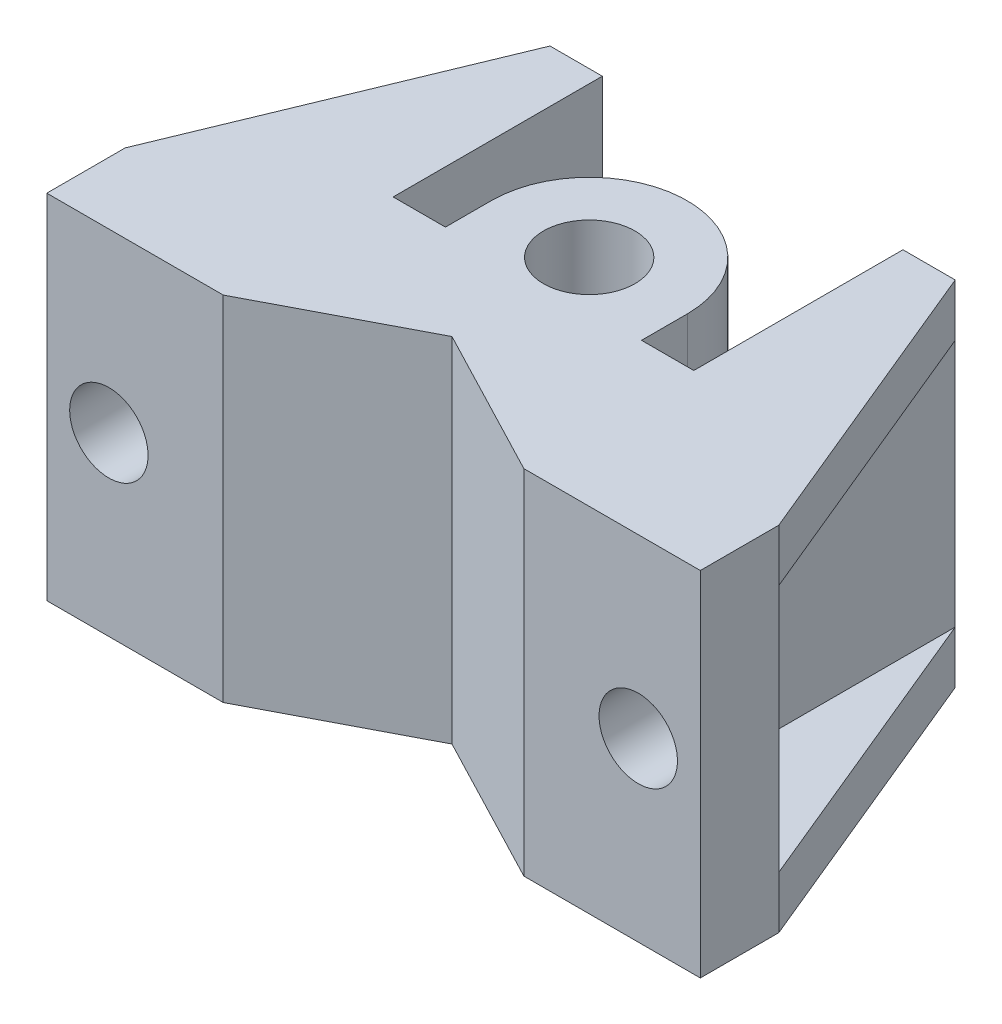
ISO-10303-21;
HEADER;
FILE_DESCRIPTION(('STEP AP214'),'2;1');
FILE_NAME('part.step','',(''),(''),'','','');
FILE_SCHEMA(('AUTOMOTIVE_DESIGN { 1 0 10303 214 1 1 1 1 }'));
ENDSEC;
DATA;
#1=APPLICATION_CONTEXT('core data for automotive mechanical design processes');
#2=APPLICATION_PROTOCOL_DEFINITION('international standard','automotive_design',2000,#1);
#3=PRODUCT_CONTEXT('',#1,'mechanical');
#4=PRODUCT('Part','Part','',(#3));
#5=PRODUCT_RELATED_PRODUCT_CATEGORY('part','',(#4));
#6=PRODUCT_DEFINITION_FORMATION('','',#4);
#7=PRODUCT_DEFINITION_CONTEXT('part definition',#1,'design');
#8=PRODUCT_DEFINITION('design','',#6,#7);
#9=PRODUCT_DEFINITION_SHAPE('','',#8);
#10=(LENGTH_UNIT() NAMED_UNIT(*) SI_UNIT(.MILLI.,.METRE.));
#11=(NAMED_UNIT(*) PLANE_ANGLE_UNIT() SI_UNIT($,.RADIAN.));
#12=(NAMED_UNIT(*) SI_UNIT($,.STERADIAN.) SOLID_ANGLE_UNIT());
#13=UNCERTAINTY_MEASURE_WITH_UNIT(LENGTH_MEASURE(1.E-05),#10,'distance_accuracy_value','');
#14=(GEOMETRIC_REPRESENTATION_CONTEXT(3) GLOBAL_UNCERTAINTY_ASSIGNED_CONTEXT((#13)) GLOBAL_UNIT_ASSIGNED_CONTEXT((#10,
#11,#12)) REPRESENTATION_CONTEXT('',''));
#15=CARTESIAN_POINT('',(0.,0.,0.));
#16=DIRECTION('',(0.,0.,1.));
#17=DIRECTION('',(1.,0.,0.));
#18=AXIS2_PLACEMENT_3D('',#15,#16,#17);
#19=CARTESIAN_POINT('',(-31.,27.,-25.));
#20=DIRECTION('',(0.924261426490025,0.,0.381760154419793));
#21=DIRECTION('',(0.381760154419793,0.,-0.924261426490025));
#22=AXIS2_PLACEMENT_3D('',#19,#20,#21);
#23=PLANE('',#22);
#24=DIRECTION('',(0.,-1.,0.));
#25=VECTOR('',#24,1.);
#26=CARTESIAN_POINT('',(-50.,27.,21.));
#27=LINE('',#26,#25);
#28=CARTESIAN_POINT('',(-50.,-19.,21.));
#29=VERTEX_POINT('',#28);
#30=CARTESIAN_POINT('',(-50.,-27.,21.));
#31=VERTEX_POINT('',#30);
#32=EDGE_CURVE('E235',#29,#31,#27,.T.);
#33=ORIENTED_EDGE('',*,*,#32,.F.);
#34=DIRECTION('',(0.381760154419793,0.,-0.924261426490025));
#35=VECTOR('',#34,1.);
#36=CARTESIAN_POINT('',(-31.,-19.,-25.));
#37=LINE('',#36,#35);
#38=CARTESIAN_POINT('',(-31.,-19.,-25.));
#39=VERTEX_POINT('',#38);
#40=EDGE_CURVE('E11',#29,#39,#37,.T.);
#41=ORIENTED_EDGE('',*,*,#40,.T.);
#42=DIRECTION('',(0.,-1.,0.));
#43=VECTOR('',#42,1.);
#44=CARTESIAN_POINT('',(-31.,27.,-25.));
#45=LINE('',#44,#43);
#46=CARTESIAN_POINT('',(-31.,-27.,-25.));
#47=VERTEX_POINT('',#46);
#48=EDGE_CURVE('E234',#39,#47,#45,.T.);
#49=ORIENTED_EDGE('',*,*,#48,.T.);
#50=DIRECTION('',(-0.381760154419793,0.,0.924261426490025));
#51=VECTOR('',#50,1.);
#52=CARTESIAN_POINT('',(-31.,-27.,-25.));
#53=LINE('',#52,#51);
#54=EDGE_CURVE('E323',#47,#31,#53,.T.);
#55=ORIENTED_EDGE('',*,*,#54,.T.);
#56=EDGE_LOOP('',(#33,#41,#49,#55));
#57=FACE_BOUND('',#56,.T.);
#58=ADVANCED_FACE('F45',(#57),#23,.F.);
#59=CARTESIAN_POINT('',(31.,27.,-25.));
#60=DIRECTION('',(-0.924261426490025,0.,0.381760154419793));
#61=DIRECTION('',(0.381760154419793,0.,0.924261426490025));
#62=AXIS2_PLACEMENT_3D('',#59,#60,#61);
#63=PLANE('',#62);
#64=DIRECTION('',(0.,-1.,0.));
#65=VECTOR('',#64,1.);
#66=CARTESIAN_POINT('',(50.,27.,21.));
#67=LINE('',#66,#65);
#68=CARTESIAN_POINT('',(50.,27.,21.));
#69=VERTEX_POINT('',#68);
#70=CARTESIAN_POINT('',(50.0000000000001,18.9999999999997,21.));
#71=VERTEX_POINT('',#70);
#72=EDGE_CURVE('E260',#69,#71,#67,.T.);
#73=ORIENTED_EDGE('',*,*,#72,.T.);
#74=DIRECTION('',(-0.381760154419793,0.,-0.924261426490025));
#75=VECTOR('',#74,1.);
#76=CARTESIAN_POINT('',(31.,18.9999999999998,-25.));
#77=LINE('',#76,#75);
#78=CARTESIAN_POINT('',(31.0000000000002,18.9999999999998,-25.));
#79=VERTEX_POINT('',#78);
#80=EDGE_CURVE('E229',#71,#79,#77,.T.);
#81=ORIENTED_EDGE('',*,*,#80,.T.);
#82=DIRECTION('',(0.,-1.,0.));
#83=VECTOR('',#82,1.);
#84=CARTESIAN_POINT('',(31.,27.,-25.));
#85=LINE('',#84,#83);
#86=CARTESIAN_POINT('',(31.,27.,-25.));
#87=VERTEX_POINT('',#86);
#88=EDGE_CURVE('E257',#87,#79,#85,.T.);
#89=ORIENTED_EDGE('',*,*,#88,.F.);
#90=DIRECTION('',(-0.381760154419793,0.,-0.924261426490025));
#91=VECTOR('',#90,1.);
#92=CARTESIAN_POINT('',(31.,27.,-25.));
#93=LINE('',#92,#91);
#94=EDGE_CURVE('E530',#69,#87,#93,.T.);
#95=ORIENTED_EDGE('',*,*,#94,.F.);
#96=EDGE_LOOP('',(#73,#81,#89,#95));
#97=FACE_BOUND('',#96,.T.);
#98=ADVANCED_FACE('F255',(#97),#63,.F.);
#99=CARTESIAN_POINT('',(0.,27.,0.));
#100=DIRECTION('',(0.,1.,0.));
#101=DIRECTION('',(0.,0.,1.));
#102=AXIS2_PLACEMENT_3D('',#99,#100,#101);
#103=PLANE('',#102);
#104=DIRECTION('',(-1.,0.,0.));
#105=VECTOR('',#104,1.);
#106=CARTESIAN_POINT('',(-23.,27.,-25.));
#107=LINE('',#106,#105);
#108=CARTESIAN_POINT('',(-23.,27.,-25.));
#109=VERTEX_POINT('',#108);
#110=CARTESIAN_POINT('',(-31.,27.,-25.));
#111=VERTEX_POINT('',#110);
#112=EDGE_CURVE('E364',#109,#111,#107,.T.);
#113=ORIENTED_EDGE('',*,*,#112,.T.);
#114=DIRECTION('',(-0.381760154419793,0.,0.924261426490025));
#115=VECTOR('',#114,1.);
#116=CARTESIAN_POINT('',(-31.,27.,-25.));
#117=LINE('',#116,#115);
#118=CARTESIAN_POINT('',(-50.,27.,21.));
#119=VERTEX_POINT('',#118);
#120=EDGE_CURVE('E467',#111,#119,#117,.T.);
#121=ORIENTED_EDGE('',*,*,#120,.T.);
#122=DIRECTION('',(0.,0.,1.));
#123=VECTOR('',#122,1.);
#124=CARTESIAN_POINT('',(-50.,27.,21.));
#125=LINE('',#124,#123);
#126=CARTESIAN_POINT('',(-50.,27.,33.));
#127=VERTEX_POINT('',#126);
#128=EDGE_CURVE('E232',#119,#127,#125,.T.);
#129=ORIENTED_EDGE('',*,*,#128,.T.);
#130=DIRECTION('',(1.,0.,0.));
#131=VECTOR('',#130,1.);
#132=CARTESIAN_POINT('',(-50.,27.,33.));
#133=LINE('',#132,#131);
#134=CARTESIAN_POINT('',(-23.,27.,33.));
#135=VERTEX_POINT('',#134);
#136=EDGE_CURVE('E307',#127,#135,#133,.T.);
#137=ORIENTED_EDGE('',*,*,#136,.T.);
#138=DIRECTION('',(0.886584846165455,0.,-0.46256600669502));
#139=VECTOR('',#138,1.);
#140=CARTESIAN_POINT('',(-23.,27.,33.));
#141=LINE('',#140,#139);
#142=CARTESIAN_POINT('',(0.,27.,21.));
#143=VERTEX_POINT('',#142);
#144=EDGE_CURVE('E518',#135,#143,#141,.T.);
#145=ORIENTED_EDGE('',*,*,#144,.T.);
#146=DIRECTION('',(0.886584846165455,0.,0.46256600669502));
#147=VECTOR('',#146,1.);
#148=CARTESIAN_POINT('',(23.,27.,33.));
#149=LINE('',#148,#147);
#150=CARTESIAN_POINT('',(23.,27.,33.));
#151=VERTEX_POINT('',#150);
#152=EDGE_CURVE('E521',#143,#151,#149,.T.);
#153=ORIENTED_EDGE('',*,*,#152,.T.);
#154=DIRECTION('',(1.,0.,0.));
#155=VECTOR('',#154,1.);
#156=CARTESIAN_POINT('',(50.,27.,33.));
#157=LINE('',#156,#155);
#158=CARTESIAN_POINT('',(50.,27.,33.));
#159=VERTEX_POINT('',#158);
#160=EDGE_CURVE('E524',#151,#159,#157,.T.);
#161=ORIENTED_EDGE('',*,*,#160,.T.);
#162=DIRECTION('',(0.,0.,-1.));
#163=VECTOR('',#162,1.);
#164=CARTESIAN_POINT('',(50.,27.,21.));
#165=LINE('',#164,#163);
#166=EDGE_CURVE('E527',#159,#69,#165,.T.);
#167=ORIENTED_EDGE('',*,*,#166,.T.);
#168=ORIENTED_EDGE('',*,*,#94,.T.);
#169=DIRECTION('',(-1.,0.,0.));
#170=VECTOR('',#169,1.);
#171=CARTESIAN_POINT('',(23.,27.,-25.));
#172=LINE('',#171,#170);
#173=CARTESIAN_POINT('',(23.,27.,-25.));
#174=VERTEX_POINT('',#173);
#175=EDGE_CURVE('E269',#87,#174,#172,.T.);
#176=ORIENTED_EDGE('',*,*,#175,.T.);
#177=DIRECTION('',(0.,0.,1.));
#178=VECTOR('',#177,1.);
#179=CARTESIAN_POINT('',(23.,27.,7.));
#180=LINE('',#179,#178);
#181=CARTESIAN_POINT('',(23.,27.,7.));
#182=VERTEX_POINT('',#181);
#183=EDGE_CURVE('E402',#174,#182,#180,.T.);
#184=ORIENTED_EDGE('',*,*,#183,.T.);
#185=DIRECTION('',(-1.,0.,0.));
#186=VECTOR('',#185,1.);
#187=CARTESIAN_POINT('',(15.,27.,7.));
#188=LINE('',#187,#186);
#189=CARTESIAN_POINT('',(15.,27.,7.));
#190=VERTEX_POINT('',#189);
#191=EDGE_CURVE('E418',#182,#190,#188,.T.);
#192=ORIENTED_EDGE('',*,*,#191,.T.);
#193=DIRECTION('',(0.,0.,-1.));
#194=VECTOR('',#193,1.);
#195=CARTESIAN_POINT('',(15.,27.,0.));
#196=LINE('',#195,#194);
#197=CARTESIAN_POINT('',(15.,27.,0.));
#198=VERTEX_POINT('',#197);
#199=EDGE_CURVE('E413',#190,#198,#196,.T.);
#200=ORIENTED_EDGE('',*,*,#199,.T.);
#201=CARTESIAN_POINT('',(0.,27.,0.));
#202=DIRECTION('',(0.,1.,0.));
#203=DIRECTION('',(0.,0.,1.));
#204=AXIS2_PLACEMENT_3D('',#201,#202,#203);
#205=CIRCLE('',#204,15.);
#206=CARTESIAN_POINT('',(-15.,27.,1.03825955065933E-13));
#207=VERTEX_POINT('',#206);
#208=EDGE_CURVE('E417',#198,#207,#205,.T.);
#209=ORIENTED_EDGE('',*,*,#208,.T.);
#210=DIRECTION('',(0.,0.,1.));
#211=VECTOR('',#210,1.);
#212=CARTESIAN_POINT('',(-15.,27.,1.02907469966573E-13));
#213=LINE('',#212,#211);
#214=CARTESIAN_POINT('',(-15.,27.,7.));
#215=VERTEX_POINT('',#214);
#216=EDGE_CURVE('E422',#207,#215,#213,.T.);
#217=ORIENTED_EDGE('',*,*,#216,.T.);
#218=DIRECTION('',(-1.,0.,0.));
#219=VECTOR('',#218,1.);
#220=CARTESIAN_POINT('',(-15.,27.,7.));
#221=LINE('',#220,#219);
#222=CARTESIAN_POINT('',(-23.,27.,7.));
#223=VERTEX_POINT('',#222);
#224=EDGE_CURVE('E429',#215,#223,#221,.T.);
#225=ORIENTED_EDGE('',*,*,#224,.T.);
#226=DIRECTION('',(0.,0.,-1.));
#227=VECTOR('',#226,1.);
#228=CARTESIAN_POINT('',(-23.,27.,7.));
#229=LINE('',#228,#227);
#230=EDGE_CURVE('E370',#223,#109,#229,.T.);
#231=ORIENTED_EDGE('',*,*,#230,.T.);
#232=EDGE_LOOP('',(#113,#121,#129,#137,#145,#153,#161,#167,#168,#176,#184,#192,#200,#209,#217,
#225,#231));
#233=FACE_BOUND('',#232,.T.);
#234=CARTESIAN_POINT('',(0.,27.,0.));
#235=DIRECTION('',(0.,1.,0.));
#236=DIRECTION('',(0.,0.,1.));
#237=AXIS2_PLACEMENT_3D('',#234,#235,#236);
#238=CIRCLE('',#237,7.);
#239=CARTESIAN_POINT('',(0.,27.,7.));
#240=VERTEX_POINT('',#239);
#241=EDGE_CURVE('E437',#240,#240,#238,.T.);
#242=ORIENTED_EDGE('',*,*,#241,.F.);
#243=EDGE_LOOP('',(#242));
#244=FACE_BOUND('',#243,.T.);
#245=ADVANCED_FACE('F465',(#233,#244),#103,.T.);
#246=CARTESIAN_POINT('',(0.,-27.,0.));
#247=DIRECTION('',(0.,1.,0.));
#248=DIRECTION('',(0.,0.,1.));
#249=AXIS2_PLACEMENT_3D('',#246,#247,#248);
#250=PLANE('',#249);
#251=DIRECTION('',(-1.,0.,0.));
#252=VECTOR('',#251,1.);
#253=CARTESIAN_POINT('',(-23.,-27.,-25.));
#254=LINE('',#253,#252);
#255=CARTESIAN_POINT('',(-23.,-27.,-25.));
#256=VERTEX_POINT('',#255);
#257=EDGE_CURVE('E434',#256,#47,#254,.T.);
#258=ORIENTED_EDGE('',*,*,#257,.F.);
#259=DIRECTION('',(0.,0.,-1.));
#260=VECTOR('',#259,1.);
#261=CARTESIAN_POINT('',(-23.,-27.,7.));
#262=LINE('',#261,#260);
#263=CARTESIAN_POINT('',(-23.,-27.,7.));
#264=VERTEX_POINT('',#263);
#265=EDGE_CURVE('E361',#264,#256,#262,.T.);
#266=ORIENTED_EDGE('',*,*,#265,.F.);
#267=DIRECTION('',(-1.,0.,0.));
#268=VECTOR('',#267,1.);
#269=CARTESIAN_POINT('',(-15.,-27.,7.));
#270=LINE('',#269,#268);
#271=CARTESIAN_POINT('',(-15.,-27.,7.));
#272=VERTEX_POINT('',#271);
#273=EDGE_CURVE('E358',#272,#264,#270,.T.);
#274=ORIENTED_EDGE('',*,*,#273,.F.);
#275=DIRECTION('',(0.,0.,1.));
#276=VECTOR('',#275,1.);
#277=CARTESIAN_POINT('',(-15.,-27.,1.02907469966573E-13));
#278=LINE('',#277,#276);
#279=CARTESIAN_POINT('',(-15.,-27.,1.03825955065933E-13));
#280=VERTEX_POINT('',#279);
#281=EDGE_CURVE('E355',#280,#272,#278,.T.);
#282=ORIENTED_EDGE('',*,*,#281,.F.);
#283=CARTESIAN_POINT('',(0.,-27.,0.));
#284=DIRECTION('',(0.,1.,0.));
#285=DIRECTION('',(0.,0.,1.));
#286=AXIS2_PLACEMENT_3D('',#283,#284,#285);
#287=CIRCLE('',#286,15.);
#288=CARTESIAN_POINT('',(15.,-27.,0.));
#289=VERTEX_POINT('',#288);
#290=EDGE_CURVE('E352',#289,#280,#287,.T.);
#291=ORIENTED_EDGE('',*,*,#290,.F.);
#292=DIRECTION('',(0.,0.,-1.));
#293=VECTOR('',#292,1.);
#294=CARTESIAN_POINT('',(15.,-27.,0.));
#295=LINE('',#294,#293);
#296=CARTESIAN_POINT('',(15.,-27.,7.));
#297=VERTEX_POINT('',#296);
#298=EDGE_CURVE('E349',#297,#289,#295,.T.);
#299=ORIENTED_EDGE('',*,*,#298,.F.);
#300=DIRECTION('',(-1.,0.,0.));
#301=VECTOR('',#300,1.);
#302=CARTESIAN_POINT('',(15.,-27.,7.));
#303=LINE('',#302,#301);
#304=CARTESIAN_POINT('',(23.,-27.,7.));
#305=VERTEX_POINT('',#304);
#306=EDGE_CURVE('E346',#305,#297,#303,.T.);
#307=ORIENTED_EDGE('',*,*,#306,.F.);
#308=DIRECTION('',(0.,0.,1.));
#309=VECTOR('',#308,1.);
#310=CARTESIAN_POINT('',(23.,-27.,7.));
#311=LINE('',#310,#309);
#312=CARTESIAN_POINT('',(23.,-27.,-25.));
#313=VERTEX_POINT('',#312);
#314=EDGE_CURVE('E343',#313,#305,#311,.T.);
#315=ORIENTED_EDGE('',*,*,#314,.F.);
#316=DIRECTION('',(-1.,0.,0.));
#317=VECTOR('',#316,1.);
#318=CARTESIAN_POINT('',(23.,-27.,-25.));
#319=LINE('',#318,#317);
#320=CARTESIAN_POINT('',(31.,-27.,-25.));
#321=VERTEX_POINT('',#320);
#322=EDGE_CURVE('E340',#321,#313,#319,.T.);
#323=ORIENTED_EDGE('',*,*,#322,.F.);
#324=DIRECTION('',(-0.381760154419793,0.,-0.924261426490025));
#325=VECTOR('',#324,1.);
#326=CARTESIAN_POINT('',(31.,-27.,-25.));
#327=LINE('',#326,#325);
#328=CARTESIAN_POINT('',(50.,-27.,21.));
#329=VERTEX_POINT('',#328);
#330=EDGE_CURVE('E336',#329,#321,#327,.T.);
#331=ORIENTED_EDGE('',*,*,#330,.F.);
#332=DIRECTION('',(0.,0.,-1.));
#333=VECTOR('',#332,1.);
#334=CARTESIAN_POINT('',(50.,-27.,21.));
#335=LINE('',#334,#333);
#336=CARTESIAN_POINT('',(50.,-27.,33.));
#337=VERTEX_POINT('',#336);
#338=EDGE_CURVE('E332',#337,#329,#335,.T.);
#339=ORIENTED_EDGE('',*,*,#338,.F.);
#340=DIRECTION('',(1.,0.,0.));
#341=VECTOR('',#340,1.);
#342=CARTESIAN_POINT('',(50.,-27.,33.));
#343=LINE('',#342,#341);
#344=CARTESIAN_POINT('',(23.,-27.,33.));
#345=VERTEX_POINT('',#344);
#346=EDGE_CURVE('E329',#345,#337,#343,.T.);
#347=ORIENTED_EDGE('',*,*,#346,.F.);
#348=DIRECTION('',(0.886584846165455,0.,0.46256600669502));
#349=VECTOR('',#348,1.);
#350=CARTESIAN_POINT('',(23.,-27.,33.));
#351=LINE('',#350,#349);
#352=CARTESIAN_POINT('',(0.,-27.,21.));
#353=VERTEX_POINT('',#352);
#354=EDGE_CURVE('E321',#353,#345,#351,.T.);
#355=ORIENTED_EDGE('',*,*,#354,.F.);
#356=DIRECTION('',(0.886584846165455,0.,-0.46256600669502));
#357=VECTOR('',#356,1.);
#358=CARTESIAN_POINT('',(-23.,-27.,33.));
#359=LINE('',#358,#357);
#360=CARTESIAN_POINT('',(-23.,-27.,33.));
#361=VERTEX_POINT('',#360);
#362=EDGE_CURVE('E316',#361,#353,#359,.T.);
#363=ORIENTED_EDGE('',*,*,#362,.F.);
#364=DIRECTION('',(1.,0.,0.));
#365=VECTOR('',#364,1.);
#366=CARTESIAN_POINT('',(-50.,-27.,33.));
#367=LINE('',#366,#365);
#368=CARTESIAN_POINT('',(-50.,-27.,33.));
#369=VERTEX_POINT('',#368);
#370=EDGE_CURVE('E306',#369,#361,#367,.T.);
#371=ORIENTED_EDGE('',*,*,#370,.F.);
#372=DIRECTION('',(0.,0.,1.));
#373=VECTOR('',#372,1.);
#374=CARTESIAN_POINT('',(-50.,-27.,21.));
#375=LINE('',#374,#373);
#376=EDGE_CURVE('E314',#31,#369,#375,.T.);
#377=ORIENTED_EDGE('',*,*,#376,.F.);
#378=ORIENTED_EDGE('',*,*,#54,.F.);
#379=EDGE_LOOP('',(#258,#266,#274,#282,#291,#299,#307,#315,#323,#331,#339,#347,#355,#363,#371,
#377,#378));
#380=FACE_BOUND('',#379,.T.);
#381=CARTESIAN_POINT('',(0.,-27.,0.));
#382=DIRECTION('',(0.,1.,0.));
#383=DIRECTION('',(0.,0.,1.));
#384=AXIS2_PLACEMENT_3D('',#381,#382,#383);
#385=CIRCLE('',#384,7.);
#386=CARTESIAN_POINT('',(0.,-27.,7.));
#387=VERTEX_POINT('',#386);
#388=EDGE_CURVE('E483',#387,#387,#385,.T.);
#389=ORIENTED_EDGE('',*,*,#388,.T.);
#390=EDGE_LOOP('',(#389));
#391=FACE_BOUND('',#390,.T.);
#392=ADVANCED_FACE('F311',(#380,#391),#250,.F.);
#393=CARTESIAN_POINT('',(-23.,27.,-25.));
#394=DIRECTION('',(0.,0.,1.));
#395=DIRECTION('',(1.,0.,0.));
#396=AXIS2_PLACEMENT_3D('',#393,#394,#395);
#397=PLANE('',#396);
#398=ORIENTED_EDGE('',*,*,#257,.T.);
#399=ORIENTED_EDGE('',*,*,#48,.F.);
#400=DIRECTION('',(0.,-1.,0.));
#401=VECTOR('',#400,1.);
#402=CARTESIAN_POINT('',(-31.,19.,-25.));
#403=LINE('',#402,#401);
#404=CARTESIAN_POINT('',(-31.,19.,-25.));
#405=VERTEX_POINT('',#404);
#406=EDGE_CURVE('E218',#405,#39,#403,.T.);
#407=ORIENTED_EDGE('',*,*,#406,.F.);
#408=EDGE_CURVE('E227',#111,#405,#45,.T.);
#409=ORIENTED_EDGE('',*,*,#408,.F.);
#410=ORIENTED_EDGE('',*,*,#112,.F.);
#411=DIRECTION('',(0.,-1.,0.));
#412=VECTOR('',#411,1.);
#413=CARTESIAN_POINT('',(-23.,27.,-25.));
#414=LINE('',#413,#412);
#415=EDGE_CURVE('E365',#109,#256,#414,.T.);
#416=ORIENTED_EDGE('',*,*,#415,.T.);
#417=EDGE_LOOP('',(#398,#399,#407,#409,#410,#416));
#418=FACE_BOUND('',#417,.T.);
#419=ADVANCED_FACE('F47',(#418),#397,.F.);
#420=ORIENTED_EDGE('',*,*,#408,.T.);
#421=DIRECTION('',(-0.381760154419793,0.,0.924261426490025));
#422=VECTOR('',#421,1.);
#423=CARTESIAN_POINT('',(-31.,19.,-25.));
#424=LINE('',#423,#422);
#425=CARTESIAN_POINT('',(-50.,19.,21.));
#426=VERTEX_POINT('',#425);
#427=EDGE_CURVE('E54',#405,#426,#424,.T.);
#428=ORIENTED_EDGE('',*,*,#427,.T.);
#429=EDGE_CURVE('E224',#119,#426,#27,.T.);
#430=ORIENTED_EDGE('',*,*,#429,.F.);
#431=ORIENTED_EDGE('',*,*,#120,.F.);
#432=EDGE_LOOP('',(#420,#428,#430,#431));
#433=FACE_BOUND('',#432,.T.);
#434=ADVANCED_FACE('F223',(#433),#23,.F.);
#435=CARTESIAN_POINT('',(-50.,27.,21.));
#436=DIRECTION('',(1.,0.,0.));
#437=DIRECTION('',(0.,0.,-1.));
#438=AXIS2_PLACEMENT_3D('',#435,#436,#437);
#439=PLANE('',#438);
#440=ORIENTED_EDGE('',*,*,#376,.T.);
#441=DIRECTION('',(0.,-1.,0.));
#442=VECTOR('',#441,1.);
#443=CARTESIAN_POINT('',(-50.,27.,33.));
#444=LINE('',#443,#442);
#445=EDGE_CURVE('E240',#127,#369,#444,.T.);
#446=ORIENTED_EDGE('',*,*,#445,.F.);
#447=ORIENTED_EDGE('',*,*,#128,.F.);
#448=ORIENTED_EDGE('',*,*,#429,.T.);
#449=DIRECTION('',(0.,1.,0.));
#450=VECTOR('',#449,1.);
#451=CARTESIAN_POINT('',(-50.,19.,21.));
#452=LINE('',#451,#450);
#453=EDGE_CURVE('E211',#29,#426,#452,.T.);
#454=ORIENTED_EDGE('',*,*,#453,.F.);
#455=ORIENTED_EDGE('',*,*,#32,.T.);
#456=EDGE_LOOP('',(#440,#446,#447,#448,#454,#455));
#457=FACE_BOUND('',#456,.T.);
#458=ADVANCED_FACE('F230',(#457),#439,.F.);
#459=CARTESIAN_POINT('',(-50.,27.,33.));
#460=DIRECTION('',(0.,0.,-1.));
#461=DIRECTION('',(-1.,0.,0.));
#462=AXIS2_PLACEMENT_3D('',#459,#460,#461);
#463=PLANE('',#462);
#464=CARTESIAN_POINT('',(-40.5,0.,33.));
#465=DIRECTION('',(0.,0.,-1.));
#466=DIRECTION('',(-1.,0.,0.));
#467=AXIS2_PLACEMENT_3D('',#464,#465,#466);
#468=CIRCLE('',#467,6.);
#469=CARTESIAN_POINT('',(-46.5,0.,33.));
#470=VERTEX_POINT('',#469);
#471=EDGE_CURVE('E619',#470,#470,#468,.T.);
#472=ORIENTED_EDGE('',*,*,#471,.T.);
#473=EDGE_LOOP('',(#472));
#474=FACE_BOUND('',#473,.T.);
#475=ORIENTED_EDGE('',*,*,#370,.T.);
#476=DIRECTION('',(0.,-1.,0.));
#477=VECTOR('',#476,1.);
#478=CARTESIAN_POINT('',(-23.,27.,33.));
#479=LINE('',#478,#477);
#480=EDGE_CURVE('E293',#135,#361,#479,.T.);
#481=ORIENTED_EDGE('',*,*,#480,.F.);
#482=ORIENTED_EDGE('',*,*,#136,.F.);
#483=ORIENTED_EDGE('',*,*,#445,.T.);
#484=EDGE_LOOP('',(#475,#481,#482,#483));
#485=FACE_BOUND('',#484,.T.);
#486=ADVANCED_FACE('F305',(#474,#485),#463,.F.);
#487=CARTESIAN_POINT('',(-23.,27.,33.));
#488=DIRECTION('',(-0.46256600669502,0.,-0.886584846165455));
#489=DIRECTION('',(-0.886584846165455,0.,0.46256600669502));
#490=AXIS2_PLACEMENT_3D('',#487,#488,#489);
#491=PLANE('',#490);
#492=ORIENTED_EDGE('',*,*,#362,.T.);
#493=DIRECTION('',(0.,-1.,0.));
#494=VECTOR('',#493,1.);
#495=CARTESIAN_POINT('',(0.,27.,21.));
#496=LINE('',#495,#494);
#497=EDGE_CURVE('E290',#143,#353,#496,.T.);
#498=ORIENTED_EDGE('',*,*,#497,.F.);
#499=ORIENTED_EDGE('',*,*,#144,.F.);
#500=ORIENTED_EDGE('',*,*,#480,.T.);
#501=EDGE_LOOP('',(#492,#498,#499,#500));
#502=FACE_BOUND('',#501,.T.);
#503=ADVANCED_FACE('F609',(#502),#491,.F.);
#504=CARTESIAN_POINT('',(23.,27.,33.));
#505=DIRECTION('',(0.46256600669502,0.,-0.886584846165455));
#506=DIRECTION('',(-0.886584846165455,0.,-0.46256600669502));
#507=AXIS2_PLACEMENT_3D('',#504,#505,#506);
#508=PLANE('',#507);
#509=ORIENTED_EDGE('',*,*,#354,.T.);
#510=DIRECTION('',(0.,-1.,0.));
#511=VECTOR('',#510,1.);
#512=CARTESIAN_POINT('',(23.,27.,33.));
#513=LINE('',#512,#511);
#514=EDGE_CURVE('E286',#151,#345,#513,.T.);
#515=ORIENTED_EDGE('',*,*,#514,.F.);
#516=ORIENTED_EDGE('',*,*,#152,.F.);
#517=ORIENTED_EDGE('',*,*,#497,.T.);
#518=EDGE_LOOP('',(#509,#515,#516,#517));
#519=FACE_BOUND('',#518,.T.);
#520=ADVANCED_FACE('F605',(#519),#508,.F.);
#521=CARTESIAN_POINT('',(50.,27.,33.));
#522=DIRECTION('',(0.,0.,-1.));
#523=DIRECTION('',(-1.,0.,0.));
#524=AXIS2_PLACEMENT_3D('',#521,#522,#523);
#525=PLANE('',#524);
#526=CARTESIAN_POINT('',(40.5,-2.81319615861701E-13,33.));
#527=DIRECTION('',(0.,0.,-1.));
#528=DIRECTION('',(-1.,0.,0.));
#529=AXIS2_PLACEMENT_3D('',#526,#527,#528);
#530=CIRCLE('',#529,6.);
#531=CARTESIAN_POINT('',(34.5,-2.81319615861701E-13,33.));
#532=VERTEX_POINT('',#531);
#533=EDGE_CURVE('E623',#532,#532,#530,.F.);
#534=ORIENTED_EDGE('',*,*,#533,.F.);
#535=EDGE_LOOP('',(#534));
#536=FACE_BOUND('',#535,.T.);
#537=ORIENTED_EDGE('',*,*,#346,.T.);
#538=DIRECTION('',(0.,-1.,0.));
#539=VECTOR('',#538,1.);
#540=CARTESIAN_POINT('',(50.,27.,33.));
#541=LINE('',#540,#539);
#542=EDGE_CURVE('E282',#159,#337,#541,.T.);
#543=ORIENTED_EDGE('',*,*,#542,.F.);
#544=ORIENTED_EDGE('',*,*,#160,.F.);
#545=ORIENTED_EDGE('',*,*,#514,.T.);
#546=EDGE_LOOP('',(#537,#543,#544,#545));
#547=FACE_BOUND('',#546,.T.);
#548=ADVANCED_FACE('F602',(#536,#547),#525,.F.);
#549=CARTESIAN_POINT('',(50.,27.,21.));
#550=DIRECTION('',(-1.,0.,0.));
#551=DIRECTION('',(0.,0.,1.));
#552=AXIS2_PLACEMENT_3D('',#549,#550,#551);
#553=PLANE('',#552);
#554=ORIENTED_EDGE('',*,*,#338,.T.);
#555=CARTESIAN_POINT('',(49.9999999999999,-19.0000000000003,21.));
#556=VERTEX_POINT('',#555);
#557=EDGE_CURVE('E271',#556,#329,#67,.T.);
#558=ORIENTED_EDGE('',*,*,#557,.F.);
#559=DIRECTION('',(0.,-1.,0.));
#560=VECTOR('',#559,1.);
#561=CARTESIAN_POINT('',(50.0000000000001,18.9999999999997,21.));
#562=LINE('',#561,#560);
#563=EDGE_CURVE('E500',#71,#556,#562,.T.);
#564=ORIENTED_EDGE('',*,*,#563,.F.);
#565=ORIENTED_EDGE('',*,*,#72,.F.);
#566=ORIENTED_EDGE('',*,*,#166,.F.);
#567=ORIENTED_EDGE('',*,*,#542,.T.);
#568=EDGE_LOOP('',(#554,#558,#564,#565,#566,#567));
#569=FACE_BOUND('',#568,.T.);
#570=ADVANCED_FACE('F540',(#569),#553,.F.);
#571=CARTESIAN_POINT('',(31.,-19.0000000000002,-25.));
#572=VERTEX_POINT('',#571);
#573=EDGE_CURVE('E272',#572,#321,#85,.T.);
#574=ORIENTED_EDGE('',*,*,#573,.F.);
#575=DIRECTION('',(0.381760154419793,0.,0.924261426490025));
#576=VECTOR('',#575,1.);
#577=CARTESIAN_POINT('',(31.,-19.0000000000002,-25.0000000000001));
#578=LINE('',#577,#576);
#579=EDGE_CURVE('E245',#572,#556,#578,.T.);
#580=ORIENTED_EDGE('',*,*,#579,.T.);
#581=ORIENTED_EDGE('',*,*,#557,.T.);
#582=ORIENTED_EDGE('',*,*,#330,.T.);
#583=EDGE_LOOP('',(#574,#580,#581,#582));
#584=FACE_BOUND('',#583,.T.);
#585=ADVANCED_FACE('F546',(#584),#63,.F.);
#586=CARTESIAN_POINT('',(23.,27.,-25.));
#587=DIRECTION('',(0.,0.,1.));
#588=DIRECTION('',(1.,0.,0.));
#589=AXIS2_PLACEMENT_3D('',#586,#587,#588);
#590=PLANE('',#589);
#591=ORIENTED_EDGE('',*,*,#322,.T.);
#592=DIRECTION('',(0.,-1.,0.));
#593=VECTOR('',#592,1.);
#594=CARTESIAN_POINT('',(23.,27.,-25.));
#595=LINE('',#594,#593);
#596=EDGE_CURVE('E277',#174,#313,#595,.T.);
#597=ORIENTED_EDGE('',*,*,#596,.F.);
#598=ORIENTED_EDGE('',*,*,#175,.F.);
#599=ORIENTED_EDGE('',*,*,#88,.T.);
#600=DIRECTION('',(0.,1.,0.));
#601=VECTOR('',#600,1.);
#602=CARTESIAN_POINT('',(31.0000000000002,18.9999999999998,-25.));
#603=LINE('',#602,#601);
#604=EDGE_CURVE('E267',#572,#79,#603,.T.);
#605=ORIENTED_EDGE('',*,*,#604,.F.);
#606=ORIENTED_EDGE('',*,*,#573,.T.);
#607=EDGE_LOOP('',(#591,#597,#598,#599,#605,#606));
#608=FACE_BOUND('',#607,.T.);
#609=ADVANCED_FACE('F266',(#608),#590,.F.);
#610=CARTESIAN_POINT('',(23.,27.,7.));
#611=DIRECTION('',(1.,0.,0.));
#612=DIRECTION('',(0.,0.,-1.));
#613=AXIS2_PLACEMENT_3D('',#610,#611,#612);
#614=PLANE('',#613);
#615=ORIENTED_EDGE('',*,*,#314,.T.);
#616=DIRECTION('',(0.,-1.,0.));
#617=VECTOR('',#616,1.);
#618=CARTESIAN_POINT('',(23.,27.,7.));
#619=LINE('',#618,#617);
#620=EDGE_CURVE('E389',#182,#305,#619,.T.);
#621=ORIENTED_EDGE('',*,*,#620,.F.);
#622=ORIENTED_EDGE('',*,*,#183,.F.);
#623=ORIENTED_EDGE('',*,*,#596,.T.);
#624=EDGE_LOOP('',(#615,#621,#622,#623));
#625=FACE_BOUND('',#624,.T.);
#626=ADVANCED_FACE('F401',(#625),#614,.F.);
#627=CARTESIAN_POINT('',(15.,27.,7.));
#628=DIRECTION('',(0.,0.,1.));
#629=DIRECTION('',(1.,0.,0.));
#630=AXIS2_PLACEMENT_3D('',#627,#628,#629);
#631=PLANE('',#630);
#632=ORIENTED_EDGE('',*,*,#306,.T.);
#633=DIRECTION('',(0.,-1.,0.));
#634=VECTOR('',#633,1.);
#635=CARTESIAN_POINT('',(15.,27.,7.));
#636=LINE('',#635,#634);
#637=EDGE_CURVE('E386',#190,#297,#636,.T.);
#638=ORIENTED_EDGE('',*,*,#637,.F.);
#639=ORIENTED_EDGE('',*,*,#191,.F.);
#640=ORIENTED_EDGE('',*,*,#620,.T.);
#641=EDGE_LOOP('',(#632,#638,#639,#640));
#642=FACE_BOUND('',#641,.T.);
#643=ADVANCED_FACE('F408',(#642),#631,.F.);
#644=CARTESIAN_POINT('',(15.,27.,0.));
#645=DIRECTION('',(-1.,0.,0.));
#646=DIRECTION('',(0.,0.,1.));
#647=AXIS2_PLACEMENT_3D('',#644,#645,#646);
#648=PLANE('',#647);
#649=ORIENTED_EDGE('',*,*,#298,.T.);
#650=DIRECTION('',(0.,-1.,0.));
#651=VECTOR('',#650,1.);
#652=CARTESIAN_POINT('',(15.,27.,0.));
#653=LINE('',#652,#651);
#654=EDGE_CURVE('E382',#198,#289,#653,.T.);
#655=ORIENTED_EDGE('',*,*,#654,.F.);
#656=ORIENTED_EDGE('',*,*,#199,.F.);
#657=ORIENTED_EDGE('',*,*,#637,.T.);
#658=EDGE_LOOP('',(#649,#655,#656,#657));
#659=FACE_BOUND('',#658,.T.);
#660=ADVANCED_FACE('F411',(#659),#648,.F.);
#661=CARTESIAN_POINT('',(0.,27.,0.));
#662=DIRECTION('',(0.,-1.,0.));
#663=DIRECTION('',(0.,0.,-1.));
#664=AXIS2_PLACEMENT_3D('',#661,#662,#663);
#665=CYLINDRICAL_SURFACE('',#664,15.);
#666=ORIENTED_EDGE('',*,*,#290,.T.);
#667=DIRECTION('',(0.,-1.,0.));
#668=VECTOR('',#667,1.);
#669=CARTESIAN_POINT('',(-15.,27.,1.03825955065933E-13));
#670=LINE('',#669,#668);
#671=EDGE_CURVE('E378',#207,#280,#670,.T.);
#672=ORIENTED_EDGE('',*,*,#671,.F.);
#673=ORIENTED_EDGE('',*,*,#208,.F.);
#674=ORIENTED_EDGE('',*,*,#654,.T.);
#675=EDGE_LOOP('',(#666,#672,#673,#674));
#676=FACE_BOUND('',#675,.T.);
#677=ADVANCED_FACE('F464',(#676),#665,.T.);
#678=CARTESIAN_POINT('',(-15.,27.,1.02907469966573E-13));
#679=DIRECTION('',(1.,0.,0.));
#680=DIRECTION('',(0.,0.,-1.));
#681=AXIS2_PLACEMENT_3D('',#678,#679,#680);
#682=PLANE('',#681);
#683=ORIENTED_EDGE('',*,*,#281,.T.);
#684=DIRECTION('',(0.,-1.,0.));
#685=VECTOR('',#684,1.);
#686=CARTESIAN_POINT('',(-15.,27.,7.));
#687=LINE('',#686,#685);
#688=EDGE_CURVE('E374',#215,#272,#687,.T.);
#689=ORIENTED_EDGE('',*,*,#688,.F.);
#690=ORIENTED_EDGE('',*,*,#216,.F.);
#691=ORIENTED_EDGE('',*,*,#671,.T.);
#692=EDGE_LOOP('',(#683,#689,#690,#691));
#693=FACE_BOUND('',#692,.T.);
#694=ADVANCED_FACE('F461',(#693),#682,.F.);
#695=CARTESIAN_POINT('',(-15.,27.,7.));
#696=DIRECTION('',(0.,0.,1.));
#697=DIRECTION('',(1.,0.,0.));
#698=AXIS2_PLACEMENT_3D('',#695,#696,#697);
#699=PLANE('',#698);
#700=ORIENTED_EDGE('',*,*,#273,.T.);
#701=DIRECTION('',(0.,-1.,0.));
#702=VECTOR('',#701,1.);
#703=CARTESIAN_POINT('',(-23.,27.,7.));
#704=LINE('',#703,#702);
#705=EDGE_CURVE('E369',#223,#264,#704,.T.);
#706=ORIENTED_EDGE('',*,*,#705,.F.);
#707=ORIENTED_EDGE('',*,*,#224,.F.);
#708=ORIENTED_EDGE('',*,*,#688,.T.);
#709=EDGE_LOOP('',(#700,#706,#707,#708));
#710=FACE_BOUND('',#709,.T.);
#711=ADVANCED_FACE('F456',(#710),#699,.F.);
#712=CARTESIAN_POINT('',(-23.,27.,7.));
#713=DIRECTION('',(-1.,0.,0.));
#714=DIRECTION('',(0.,0.,1.));
#715=AXIS2_PLACEMENT_3D('',#712,#713,#714);
#716=PLANE('',#715);
#717=ORIENTED_EDGE('',*,*,#265,.T.);
#718=ORIENTED_EDGE('',*,*,#415,.F.);
#719=ORIENTED_EDGE('',*,*,#230,.F.);
#720=ORIENTED_EDGE('',*,*,#705,.T.);
#721=EDGE_LOOP('',(#717,#718,#719,#720));
#722=FACE_BOUND('',#721,.T.);
#723=ADVANCED_FACE('F451',(#722),#716,.F.);
#724=CARTESIAN_POINT('',(0.,27.,0.));
#725=DIRECTION('',(0.,-1.,0.));
#726=DIRECTION('',(0.,0.,-1.));
#727=AXIS2_PLACEMENT_3D('',#724,#725,#726);
#728=CYLINDRICAL_SURFACE('',#727,7.);
#729=ORIENTED_EDGE('',*,*,#241,.T.);
#730=EDGE_LOOP('',(#729));
#731=FACE_BOUND('',#730,.T.);
#732=ORIENTED_EDGE('',*,*,#388,.F.);
#733=EDGE_LOOP('',(#732));
#734=FACE_BOUND('',#733,.T.);
#735=ADVANCED_FACE('F558',(#731,#734),#728,.F.);
#736=CARTESIAN_POINT('',(50.0000000000001,18.9999999999997,21.));
#737=DIRECTION('',(0.,1.,0.));
#738=DIRECTION('',(-1.,0.,0.));
#739=AXIS2_PLACEMENT_3D('',#736,#737,#738);
#740=PLANE('',#739);
#741=DIRECTION('',(1.,0.,0.));
#742=VECTOR('',#741,1.);
#743=CARTESIAN_POINT('',(50.0000000000001,18.9999999999997,21.));
#744=LINE('',#743,#742);
#745=CARTESIAN_POINT('',(31.0000000000001,18.9999999999998,21.));
#746=VERTEX_POINT('',#745);
#747=EDGE_CURVE('E475',#746,#71,#744,.T.);
#748=ORIENTED_EDGE('',*,*,#747,.F.);
#749=DIRECTION('',(0.,0.,-1.));
#750=VECTOR('',#749,1.);
#751=CARTESIAN_POINT('',(31.0000000000001,18.9999999999998,21.));
#752=LINE('',#751,#750);
#753=EDGE_CURVE('E489',#746,#79,#752,.T.);
#754=ORIENTED_EDGE('',*,*,#753,.T.);
#755=ORIENTED_EDGE('',*,*,#80,.F.);
#756=EDGE_LOOP('',(#748,#754,#755));
#757=FACE_BOUND('',#756,.T.);
#758=ADVANCED_FACE('F551',(#757),#740,.F.);
#759=CARTESIAN_POINT('',(49.9999999999999,-19.0000000000003,21.));
#760=DIRECTION('',(0.,-1.,0.));
#761=DIRECTION('',(1.,0.,0.));
#762=AXIS2_PLACEMENT_3D('',#759,#760,#761);
#763=PLANE('',#762);
#764=DIRECTION('',(0.,0.,-1.));
#765=VECTOR('',#764,1.);
#766=CARTESIAN_POINT('',(30.9999999999999,-19.0000000000002,21.));
#767=LINE('',#766,#765);
#768=CARTESIAN_POINT('',(30.9999999999999,-19.0000000000002,21.));
#769=VERTEX_POINT('',#768);
#770=EDGE_CURVE('E69',#769,#572,#767,.T.);
#771=ORIENTED_EDGE('',*,*,#770,.F.);
#772=DIRECTION('',(-1.,0.,0.));
#773=VECTOR('',#772,1.);
#774=CARTESIAN_POINT('',(49.9999999999999,-19.0000000000003,21.));
#775=LINE('',#774,#773);
#776=EDGE_CURVE('E496',#556,#769,#775,.T.);
#777=ORIENTED_EDGE('',*,*,#776,.F.);
#778=ORIENTED_EDGE('',*,*,#579,.F.);
#779=EDGE_LOOP('',(#771,#777,#778));
#780=FACE_BOUND('',#779,.T.);
#781=ADVANCED_FACE('F548',(#780),#763,.F.);
#782=CARTESIAN_POINT('',(31.0000000000001,18.9999999999998,21.));
#783=DIRECTION('',(-1.,0.,0.));
#784=DIRECTION('',(0.,-1.,0.));
#785=AXIS2_PLACEMENT_3D('',#782,#783,#784);
#786=PLANE('',#785);
#787=ORIENTED_EDGE('',*,*,#604,.T.);
#788=ORIENTED_EDGE('',*,*,#753,.F.);
#789=DIRECTION('',(0.,1.,0.));
#790=VECTOR('',#789,1.);
#791=CARTESIAN_POINT('',(31.0000000000001,18.9999999999998,21.));
#792=LINE('',#791,#790);
#793=EDGE_CURVE('E488',#769,#746,#792,.T.);
#794=ORIENTED_EDGE('',*,*,#793,.F.);
#795=ORIENTED_EDGE('',*,*,#770,.T.);
#796=EDGE_LOOP('',(#787,#788,#794,#795));
#797=FACE_BOUND('',#796,.T.);
#798=ADVANCED_FACE('F550',(#797),#786,.F.);
#799=CARTESIAN_POINT('',(0.,0.,21.));
#800=DIRECTION('',(0.,0.,1.));
#801=DIRECTION('',(1.,0.,0.));
#802=AXIS2_PLACEMENT_3D('',#799,#800,#801);
#803=PLANE('',#802);
#804=CARTESIAN_POINT('',(40.5,-2.81319615861701E-13,21.));
#805=DIRECTION('',(0.,0.,1.));
#806=DIRECTION('',(1.,0.,0.));
#807=AXIS2_PLACEMENT_3D('',#804,#805,#806);
#808=CIRCLE('',#807,6.);
#809=CARTESIAN_POINT('',(46.5,-2.81319615861701E-13,21.));
#810=VERTEX_POINT('',#809);
#811=EDGE_CURVE('E491',#810,#810,#808,.F.);
#812=ORIENTED_EDGE('',*,*,#811,.F.);
#813=EDGE_LOOP('',(#812));
#814=FACE_BOUND('',#813,.T.);
#815=ORIENTED_EDGE('',*,*,#747,.T.);
#816=ORIENTED_EDGE('',*,*,#563,.T.);
#817=ORIENTED_EDGE('',*,*,#776,.T.);
#818=ORIENTED_EDGE('',*,*,#793,.T.);
#819=EDGE_LOOP('',(#815,#816,#817,#818));
#820=FACE_BOUND('',#819,.T.);
#821=ADVANCED_FACE('F543',(#814,#820),#803,.F.);
#822=CARTESIAN_POINT('',(-50.,-19.,21.));
#823=DIRECTION('',(0.,-1.,0.));
#824=DIRECTION('',(1.,0.,0.));
#825=AXIS2_PLACEMENT_3D('',#822,#823,#824);
#826=PLANE('',#825);
#827=DIRECTION('',(-1.,0.,0.));
#828=VECTOR('',#827,1.);
#829=CARTESIAN_POINT('',(-50.,-19.,21.));
#830=LINE('',#829,#828);
#831=CARTESIAN_POINT('',(-31.,-19.,21.));
#832=VERTEX_POINT('',#831);
#833=EDGE_CURVE('E61',#832,#29,#830,.T.);
#834=ORIENTED_EDGE('',*,*,#833,.F.);
#835=DIRECTION('',(0.,0.,-1.));
#836=VECTOR('',#835,1.);
#837=CARTESIAN_POINT('',(-31.,-19.,21.));
#838=LINE('',#837,#836);
#839=EDGE_CURVE('E480',#832,#39,#838,.T.);
#840=ORIENTED_EDGE('',*,*,#839,.T.);
#841=ORIENTED_EDGE('',*,*,#40,.F.);
#842=EDGE_LOOP('',(#834,#840,#841));
#843=FACE_BOUND('',#842,.T.);
#844=ADVANCED_FACE('F637',(#843),#826,.F.);
#845=CARTESIAN_POINT('',(-50.,19.,21.));
#846=DIRECTION('',(0.,1.,0.));
#847=DIRECTION('',(-1.,0.,0.));
#848=AXIS2_PLACEMENT_3D('',#845,#846,#847);
#849=PLANE('',#848);
#850=DIRECTION('',(0.,0.,-1.));
#851=VECTOR('',#850,1.);
#852=CARTESIAN_POINT('',(-31.,19.,21.));
#853=LINE('',#852,#851);
#854=CARTESIAN_POINT('',(-31.,19.,21.));
#855=VERTEX_POINT('',#854);
#856=EDGE_CURVE('E207',#855,#405,#853,.T.);
#857=ORIENTED_EDGE('',*,*,#856,.F.);
#858=DIRECTION('',(1.,0.,0.));
#859=VECTOR('',#858,1.);
#860=CARTESIAN_POINT('',(-50.,19.,21.));
#861=LINE('',#860,#859);
#862=EDGE_CURVE('E203',#426,#855,#861,.T.);
#863=ORIENTED_EDGE('',*,*,#862,.F.);
#864=ORIENTED_EDGE('',*,*,#427,.F.);
#865=EDGE_LOOP('',(#857,#863,#864));
#866=FACE_BOUND('',#865,.T.);
#867=ADVANCED_FACE('F204',(#866),#849,.F.);
#868=CARTESIAN_POINT('',(-31.,19.,21.));
#869=DIRECTION('',(1.,0.,0.));
#870=DIRECTION('',(0.,0.,-1.));
#871=AXIS2_PLACEMENT_3D('',#868,#869,#870);
#872=PLANE('',#871);
#873=ORIENTED_EDGE('',*,*,#406,.T.);
#874=ORIENTED_EDGE('',*,*,#839,.F.);
#875=DIRECTION('',(0.,-1.,0.));
#876=VECTOR('',#875,1.);
#877=CARTESIAN_POINT('',(-31.,19.,21.));
#878=LINE('',#877,#876);
#879=EDGE_CURVE('E210',#855,#832,#878,.T.);
#880=ORIENTED_EDGE('',*,*,#879,.F.);
#881=ORIENTED_EDGE('',*,*,#856,.T.);
#882=EDGE_LOOP('',(#873,#874,#880,#881));
#883=FACE_BOUND('',#882,.T.);
#884=ADVANCED_FACE('F638',(#883),#872,.F.);
#885=CARTESIAN_POINT('',(0.,0.,21.));
#886=DIRECTION('',(0.,0.,1.));
#887=DIRECTION('',(1.,0.,0.));
#888=AXIS2_PLACEMENT_3D('',#885,#886,#887);
#889=PLANE('',#888);
#890=CARTESIAN_POINT('',(-40.5,0.,21.));
#891=DIRECTION('',(0.,0.,1.));
#892=DIRECTION('',(1.,0.,0.));
#893=AXIS2_PLACEMENT_3D('',#890,#891,#892);
#894=CIRCLE('',#893,6.);
#895=CARTESIAN_POINT('',(-34.5,0.,21.));
#896=VERTEX_POINT('',#895);
#897=EDGE_CURVE('E622',#896,#896,#894,.T.);
#898=ORIENTED_EDGE('',*,*,#897,.T.);
#899=EDGE_LOOP('',(#898));
#900=FACE_BOUND('',#899,.T.);
#901=ORIENTED_EDGE('',*,*,#453,.T.);
#902=ORIENTED_EDGE('',*,*,#862,.T.);
#903=ORIENTED_EDGE('',*,*,#879,.T.);
#904=ORIENTED_EDGE('',*,*,#833,.T.);
#905=EDGE_LOOP('',(#901,#902,#903,#904));
#906=FACE_BOUND('',#905,.T.);
#907=ADVANCED_FACE('F214',(#900,#906),#889,.F.);
#908=CARTESIAN_POINT('',(-40.5,0.,33.));
#909=DIRECTION('',(0.,0.,-1.));
#910=DIRECTION('',(-1.,0.,0.));
#911=AXIS2_PLACEMENT_3D('',#908,#909,#910);
#912=CYLINDRICAL_SURFACE('',#911,6.);
#913=ORIENTED_EDGE('',*,*,#471,.F.);
#914=EDGE_LOOP('',(#913));
#915=FACE_BOUND('',#914,.T.);
#916=ORIENTED_EDGE('',*,*,#897,.F.);
#917=EDGE_LOOP('',(#916));
#918=FACE_BOUND('',#917,.T.);
#919=ADVANCED_FACE('F644',(#915,#918),#912,.F.);
#920=CARTESIAN_POINT('',(40.5,-2.81319615861701E-13,33.));
#921=DIRECTION('',(0.,0.,-1.));
#922=DIRECTION('',(-1.,0.,0.));
#923=AXIS2_PLACEMENT_3D('',#920,#921,#922);
#924=CYLINDRICAL_SURFACE('',#923,6.);
#925=ORIENTED_EDGE('',*,*,#533,.T.);
#926=EDGE_LOOP('',(#925));
#927=FACE_BOUND('',#926,.T.);
#928=ORIENTED_EDGE('',*,*,#811,.T.);
#929=EDGE_LOOP('',(#928));
#930=FACE_BOUND('',#929,.T.);
#931=ADVANCED_FACE('F651',(#927,#930),#924,.F.);
#932=CLOSED_SHELL('',(#58,#98,#245,#392,#419,#434,#458,#486,#503,#520,#548,#570,#585,#609,#626,
#643,#660,#677,#694,#711,#723,#735,#758,#781,#798,#821,#844,#867,#884,#907,#919,#931));
#933=MANIFOLD_SOLID_BREP('B2',#932);
#934=ADVANCED_BREP_SHAPE_REPRESENTATION('',(#18,#933),#14);
#935=SHAPE_DEFINITION_REPRESENTATION(#9,#934);
ENDSEC;
END-ISO-10303-21;
